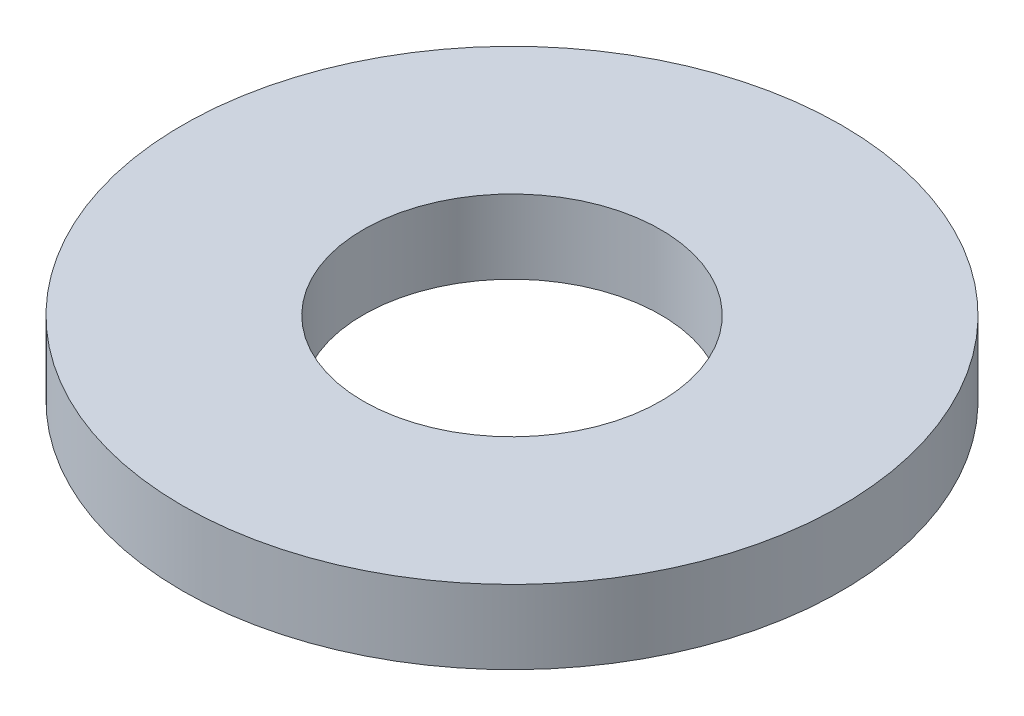
ISO-10303-21;
HEADER;
FILE_DESCRIPTION(('STEP AP214'),'2;1');
FILE_NAME('part.step','',(''),(''),'','','');
FILE_SCHEMA(('AUTOMOTIVE_DESIGN { 1 0 10303 214 1 1 1 1 }'));
ENDSEC;
DATA;
#1=APPLICATION_CONTEXT('core data for automotive mechanical design processes');
#2=APPLICATION_PROTOCOL_DEFINITION('international standard','automotive_design',2000,#1);
#3=PRODUCT_CONTEXT('',#1,'mechanical');
#4=PRODUCT('Part','Part','',(#3));
#5=PRODUCT_RELATED_PRODUCT_CATEGORY('part','',(#4));
#6=PRODUCT_DEFINITION_FORMATION('','',#4);
#7=PRODUCT_DEFINITION_CONTEXT('part definition',#1,'design');
#8=PRODUCT_DEFINITION('design','',#6,#7);
#9=PRODUCT_DEFINITION_SHAPE('','',#8);
#10=(LENGTH_UNIT() NAMED_UNIT(*) SI_UNIT(.MILLI.,.METRE.));
#11=(NAMED_UNIT(*) PLANE_ANGLE_UNIT() SI_UNIT($,.RADIAN.));
#12=(NAMED_UNIT(*) SI_UNIT($,.STERADIAN.) SOLID_ANGLE_UNIT());
#13=UNCERTAINTY_MEASURE_WITH_UNIT(LENGTH_MEASURE(1.E-05),#10,'distance_accuracy_value','');
#14=(GEOMETRIC_REPRESENTATION_CONTEXT(3) GLOBAL_UNCERTAINTY_ASSIGNED_CONTEXT((#13)) GLOBAL_UNIT_ASSIGNED_CONTEXT((#10,
#11,#12)) REPRESENTATION_CONTEXT('',''));
#15=CARTESIAN_POINT('',(0.,0.,0.));
#16=DIRECTION('',(0.,0.,1.));
#17=DIRECTION('',(1.,0.,0.));
#18=AXIS2_PLACEMENT_3D('',#15,#16,#17);
#19=CARTESIAN_POINT('',(0.,1.778,0.));
#20=DIRECTION('',(0.,-1.,0.));
#21=DIRECTION('',(0.,0.,-1.));
#22=AXIS2_PLACEMENT_3D('',#19,#20,#21);
#23=CYLINDRICAL_SURFACE('',#22,7.9375);
#24=CARTESIAN_POINT('',(0.,1.778,0.));
#25=DIRECTION('',(0.,1.,0.));
#26=DIRECTION('',(0.,0.,1.));
#27=AXIS2_PLACEMENT_3D('',#24,#25,#26);
#28=CIRCLE('',#27,7.9375);
#29=CARTESIAN_POINT('',(0.,1.778,7.9375));
#30=VERTEX_POINT('',#29);
#31=EDGE_CURVE('E10',#30,#30,#28,.T.);
#32=ORIENTED_EDGE('',*,*,#31,.F.);
#33=EDGE_LOOP('',(#32));
#34=FACE_BOUND('',#33,.T.);
#35=CARTESIAN_POINT('',(0.,0.,0.));
#36=DIRECTION('',(0.,1.,0.));
#37=DIRECTION('',(0.,0.,1.));
#38=AXIS2_PLACEMENT_3D('',#35,#36,#37);
#39=CIRCLE('',#38,7.9375);
#40=CARTESIAN_POINT('',(0.,0.,7.9375));
#41=VERTEX_POINT('',#40);
#42=EDGE_CURVE('E33',#41,#41,#39,.T.);
#43=ORIENTED_EDGE('',*,*,#42,.T.);
#44=EDGE_LOOP('',(#43));
#45=FACE_BOUND('',#44,.T.);
#46=ADVANCED_FACE('F30',(#34,#45),#23,.T.);
#47=CARTESIAN_POINT('',(0.,1.778,0.));
#48=DIRECTION('',(0.,1.,0.));
#49=DIRECTION('',(0.,0.,1.));
#50=AXIS2_PLACEMENT_3D('',#47,#48,#49);
#51=PLANE('',#50);
#52=CARTESIAN_POINT('',(0.,1.778,0.));
#53=DIRECTION('',(0.,1.,0.));
#54=DIRECTION('',(0.,0.,1.));
#55=AXIS2_PLACEMENT_3D('',#52,#53,#54);
#56=CIRCLE('',#55,3.5814);
#57=CARTESIAN_POINT('',(0.,1.778,3.5814));
#58=VERTEX_POINT('',#57);
#59=EDGE_CURVE('E42',#58,#58,#56,.T.);
#60=ORIENTED_EDGE('',*,*,#59,.F.);
#61=EDGE_LOOP('',(#60));
#62=FACE_BOUND('',#61,.T.);
#63=ORIENTED_EDGE('',*,*,#31,.T.);
#64=EDGE_LOOP('',(#63));
#65=FACE_BOUND('',#64,.T.);
#66=ADVANCED_FACE('F57',(#62,#65),#51,.T.);
#67=CARTESIAN_POINT('',(0.,0.,0.));
#68=DIRECTION('',(0.,1.,0.));
#69=DIRECTION('',(0.,0.,1.));
#70=AXIS2_PLACEMENT_3D('',#67,#68,#69);
#71=PLANE('',#70);
#72=CARTESIAN_POINT('',(0.,0.,0.));
#73=DIRECTION('',(0.,1.,0.));
#74=DIRECTION('',(0.,0.,1.));
#75=AXIS2_PLACEMENT_3D('',#72,#73,#74);
#76=CIRCLE('',#75,3.5814);
#77=CARTESIAN_POINT('',(0.,0.,3.5814));
#78=VERTEX_POINT('',#77);
#79=EDGE_CURVE('E40',#78,#78,#76,.T.);
#80=ORIENTED_EDGE('',*,*,#79,.T.);
#81=EDGE_LOOP('',(#80));
#82=FACE_BOUND('',#81,.T.);
#83=ORIENTED_EDGE('',*,*,#42,.F.);
#84=EDGE_LOOP('',(#83));
#85=FACE_BOUND('',#84,.T.);
#86=ADVANCED_FACE('F48',(#82,#85),#71,.F.);
#87=CARTESIAN_POINT('',(0.,0.,0.));
#88=DIRECTION('',(0.,1.,0.));
#89=DIRECTION('',(0.,0.,1.));
#90=AXIS2_PLACEMENT_3D('',#87,#88,#89);
#91=CYLINDRICAL_SURFACE('',#90,3.5814);
#92=ORIENTED_EDGE('',*,*,#79,.F.);
#93=EDGE_LOOP('',(#92));
#94=FACE_BOUND('',#93,.T.);
#95=ORIENTED_EDGE('',*,*,#59,.T.);
#96=EDGE_LOOP('',(#95));
#97=FACE_BOUND('',#96,.T.);
#98=ADVANCED_FACE('F51',(#94,#97),#91,.F.);
#99=CLOSED_SHELL('',(#46,#66,#86,#98));
#100=MANIFOLD_SOLID_BREP('B2',#99);
#101=ADVANCED_BREP_SHAPE_REPRESENTATION('',(#18,#100),#14);
#102=SHAPE_DEFINITION_REPRESENTATION(#9,#101);
ENDSEC;
END-ISO-10303-21;
